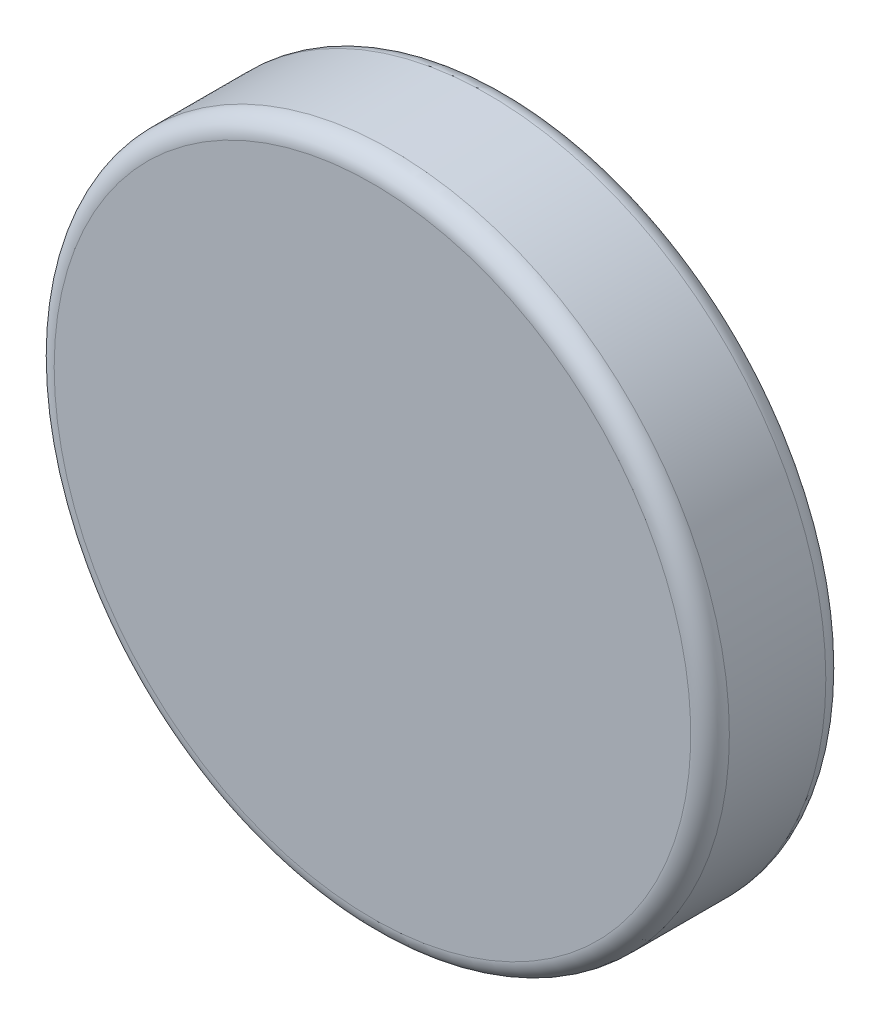
ISO-10303-21;
HEADER;
FILE_DESCRIPTION(('STEP AP214'),'2;1');
FILE_NAME('part.step','',(''),(''),'','','');
FILE_SCHEMA(('AUTOMOTIVE_DESIGN { 1 0 10303 214 1 1 1 1 }'));
ENDSEC;
DATA;
#1=APPLICATION_CONTEXT('core data for automotive mechanical design processes');
#2=APPLICATION_PROTOCOL_DEFINITION('international standard','automotive_design',2000,#1);
#3=PRODUCT_CONTEXT('',#1,'mechanical');
#4=PRODUCT('Part','Part','',(#3));
#5=PRODUCT_RELATED_PRODUCT_CATEGORY('part','',(#4));
#6=PRODUCT_DEFINITION_FORMATION('','',#4);
#7=PRODUCT_DEFINITION_CONTEXT('part definition',#1,'design');
#8=PRODUCT_DEFINITION('design','',#6,#7);
#9=PRODUCT_DEFINITION_SHAPE('','',#8);
#10=(LENGTH_UNIT() NAMED_UNIT(*) SI_UNIT(.MILLI.,.METRE.));
#11=(NAMED_UNIT(*) PLANE_ANGLE_UNIT() SI_UNIT($,.RADIAN.));
#12=(NAMED_UNIT(*) SI_UNIT($,.STERADIAN.) SOLID_ANGLE_UNIT());
#13=UNCERTAINTY_MEASURE_WITH_UNIT(LENGTH_MEASURE(1.E-05),#10,'distance_accuracy_value','');
#14=(GEOMETRIC_REPRESENTATION_CONTEXT(3) GLOBAL_UNCERTAINTY_ASSIGNED_CONTEXT((#13)) GLOBAL_UNIT_ASSIGNED_CONTEXT((#10,
#11,#12)) REPRESENTATION_CONTEXT('',''));
#15=CARTESIAN_POINT('',(0.,0.,0.));
#16=DIRECTION('',(0.,0.,1.));
#17=DIRECTION('',(1.,0.,0.));
#18=AXIS2_PLACEMENT_3D('',#15,#16,#17);
#19=CARTESIAN_POINT('',(-133.270827388158,0.,1.));
#20=DIRECTION('',(0.,0.,-1.));
#21=DIRECTION('',(-1.,0.,0.));
#22=AXIS2_PLACEMENT_3D('',#19,#20,#21);
#23=CYLINDRICAL_SURFACE('',#22,3.99999999999999);
#24=CARTESIAN_POINT('',(-133.270827388158,0.,0.5));
#25=DIRECTION('',(0.,0.,1.));
#26=DIRECTION('',(1.,0.,0.));
#27=AXIS2_PLACEMENT_3D('',#24,#25,#26);
#28=CIRCLE('',#27,3.99999999999999);
#29=CARTESIAN_POINT('',(-129.270827388158,0.,0.5));
#30=VERTEX_POINT('',#29);
#31=EDGE_CURVE('E42',#30,#30,#28,.F.);
#32=ORIENTED_EDGE('',*,*,#31,.T.);
#33=EDGE_LOOP('',(#32));
#34=FACE_BOUND('',#33,.T.);
#35=CARTESIAN_POINT('',(-133.270827388158,0.,0.));
#36=DIRECTION('',(0.,0.,1.));
#37=DIRECTION('',(1.,0.,0.));
#38=AXIS2_PLACEMENT_3D('',#35,#36,#37);
#39=CIRCLE('',#38,3.99999999999999);
#40=CARTESIAN_POINT('',(-129.270827388158,0.,0.));
#41=VERTEX_POINT('',#40);
#42=EDGE_CURVE('E57',#41,#41,#39,.T.);
#43=ORIENTED_EDGE('',*,*,#42,.T.);
#44=EDGE_LOOP('',(#43));
#45=FACE_BOUND('',#44,.T.);
#46=ADVANCED_FACE('F31',(#34,#45),#23,.T.);
#47=CARTESIAN_POINT('',(-133.270827388158,0.,0.));
#48=DIRECTION('',(0.,0.,1.));
#49=DIRECTION('',(1.,0.,0.));
#50=AXIS2_PLACEMENT_3D('',#47,#48,#49);
#51=PLANE('',#50);
#52=ORIENTED_EDGE('',*,*,#42,.F.);
#53=EDGE_LOOP('',(#52));
#54=FACE_BOUND('',#53,.T.);
#55=ADVANCED_FACE('F62',(#54),#51,.F.);
#56=CARTESIAN_POINT('',(-133.270827388158,0.,1.));
#57=DIRECTION('',(0.,0.,1.));
#58=DIRECTION('',(1.,0.,0.));
#59=AXIS2_PLACEMENT_3D('',#56,#57,#58);
#60=PLANE('',#59);
#61=CARTESIAN_POINT('',(-133.270827388158,0.,1.));
#62=DIRECTION('',(0.,0.,1.));
#63=DIRECTION('',(1.,0.,0.));
#64=AXIS2_PLACEMENT_3D('',#61,#62,#63);
#65=CIRCLE('',#64,8.24999999999999);
#66=CARTESIAN_POINT('',(-125.020827388158,0.,1.));
#67=VERTEX_POINT('',#66);
#68=EDGE_CURVE('E46',#67,#67,#65,.F.);
#69=ORIENTED_EDGE('',*,*,#68,.T.);
#70=EDGE_LOOP('',(#69));
#71=FACE_BOUND('',#70,.T.);
#72=CARTESIAN_POINT('',(-133.270827388158,0.,1.));
#73=DIRECTION('',(0.,0.,1.));
#74=DIRECTION('',(1.,0.,0.));
#75=AXIS2_PLACEMENT_3D('',#72,#73,#74);
#76=CIRCLE('',#75,4.49999999999999);
#77=CARTESIAN_POINT('',(-128.770827388158,0.,1.));
#78=VERTEX_POINT('',#77);
#79=EDGE_CURVE('E51',#78,#78,#76,.T.);
#80=ORIENTED_EDGE('',*,*,#79,.T.);
#81=EDGE_LOOP('',(#80));
#82=FACE_BOUND('',#81,.T.);
#83=ADVANCED_FACE('F64',(#71,#82),#60,.F.);
#84=CARTESIAN_POINT('',(-133.270827388158,0.,29.7487373415291));
#85=DIRECTION('',(0.,0.,-1.));
#86=DIRECTION('',(-1.,0.,0.));
#87=AXIS2_PLACEMENT_3D('',#84,#85,#86);
#88=CYLINDRICAL_SURFACE('',#87,8.74999999999999);
#89=CARTESIAN_POINT('',(-133.270827388158,0.,4.));
#90=DIRECTION('',(0.,0.,-1.));
#91=DIRECTION('',(-1.,0.,0.));
#92=AXIS2_PLACEMENT_3D('',#89,#90,#91);
#93=CIRCLE('',#92,8.74999999999999);
#94=CARTESIAN_POINT('',(-142.020827388158,0.,4.));
#95=VERTEX_POINT('',#94);
#96=EDGE_CURVE('E38',#95,#95,#93,.T.);
#97=ORIENTED_EDGE('',*,*,#96,.T.);
#98=EDGE_LOOP('',(#97));
#99=FACE_BOUND('',#98,.T.);
#100=CARTESIAN_POINT('',(-133.270827388158,0.,1.5));
#101=DIRECTION('',(0.,0.,1.));
#102=DIRECTION('',(1.,0.,0.));
#103=AXIS2_PLACEMENT_3D('',#100,#101,#102);
#104=CIRCLE('',#103,8.74999999999999);
#105=CARTESIAN_POINT('',(-124.520827388158,0.,1.5));
#106=VERTEX_POINT('',#105);
#107=EDGE_CURVE('E54',#106,#106,#104,.T.);
#108=ORIENTED_EDGE('',*,*,#107,.T.);
#109=EDGE_LOOP('',(#108));
#110=FACE_BOUND('',#109,.T.);
#111=ADVANCED_FACE('F70',(#99,#110),#88,.T.);
#112=CARTESIAN_POINT('',(0.,0.,4.5));
#113=DIRECTION('',(0.,0.,-1.));
#114=DIRECTION('',(0.,1.,0.));
#115=AXIS2_PLACEMENT_3D('',#112,#113,#114);
#116=PLANE('',#115);
#117=CARTESIAN_POINT('',(-133.270827388158,0.,4.5));
#118=DIRECTION('',(0.,0.,-1.));
#119=DIRECTION('',(-1.,0.,0.));
#120=AXIS2_PLACEMENT_3D('',#117,#118,#119);
#121=CIRCLE('',#120,8.24999999999999);
#122=CARTESIAN_POINT('',(-141.520827388158,0.,4.5));
#123=VERTEX_POINT('',#122);
#124=EDGE_CURVE('E10',#123,#123,#121,.F.);
#125=ORIENTED_EDGE('',*,*,#124,.T.);
#126=EDGE_LOOP('',(#125));
#127=FACE_BOUND('',#126,.T.);
#128=ADVANCED_FACE('F80',(#127),#116,.F.);
#129=CARTESIAN_POINT('',(-133.270827388158,0.,1.5));
#130=DIRECTION('',(0.,0.,1.));
#131=DIRECTION('',(1.,0.,0.));
#132=AXIS2_PLACEMENT_3D('',#129,#130,#131);
#133=TOROIDAL_SURFACE('',#132,8.24999999999999,0.5);
#134=ORIENTED_EDGE('',*,*,#68,.F.);
#135=EDGE_LOOP('',(#134));
#136=FACE_BOUND('',#135,.T.);
#137=ORIENTED_EDGE('',*,*,#107,.F.);
#138=EDGE_LOOP('',(#137));
#139=FACE_BOUND('',#138,.T.);
#140=ADVANCED_FACE('F77',(#136,#139),#133,.T.);
#141=CARTESIAN_POINT('',(-133.270827388158,0.,0.5));
#142=DIRECTION('',(0.,0.,1.));
#143=DIRECTION('',(1.,0.,0.));
#144=AXIS2_PLACEMENT_3D('',#141,#142,#143);
#145=TOROIDAL_SURFACE('',#144,4.49999999999999,0.5);
#146=ORIENTED_EDGE('',*,*,#31,.F.);
#147=EDGE_LOOP('',(#146));
#148=FACE_BOUND('',#147,.T.);
#149=ORIENTED_EDGE('',*,*,#79,.F.);
#150=EDGE_LOOP('',(#149));
#151=FACE_BOUND('',#150,.T.);
#152=ADVANCED_FACE('F79',(#148,#151),#145,.F.);
#153=CARTESIAN_POINT('',(-133.270827388158,0.,4.));
#154=DIRECTION('',(0.,0.,-1.));
#155=DIRECTION('',(-1.,0.,0.));
#156=AXIS2_PLACEMENT_3D('',#153,#154,#155);
#157=TOROIDAL_SURFACE('',#156,8.24999999999999,0.5);
#158=ORIENTED_EDGE('',*,*,#124,.F.);
#159=EDGE_LOOP('',(#158));
#160=FACE_BOUND('',#159,.T.);
#161=ORIENTED_EDGE('',*,*,#96,.F.);
#162=EDGE_LOOP('',(#161));
#163=FACE_BOUND('',#162,.T.);
#164=ADVANCED_FACE('F33',(#160,#163),#157,.T.);
#165=CLOSED_SHELL('',(#46,#55,#83,#111,#128,#140,#152,#164));
#166=MANIFOLD_SOLID_BREP('B2',#165);
#167=ADVANCED_BREP_SHAPE_REPRESENTATION('',(#18,#166),#14);
#168=SHAPE_DEFINITION_REPRESENTATION(#9,#167);
ENDSEC;
END-ISO-10303-21;
